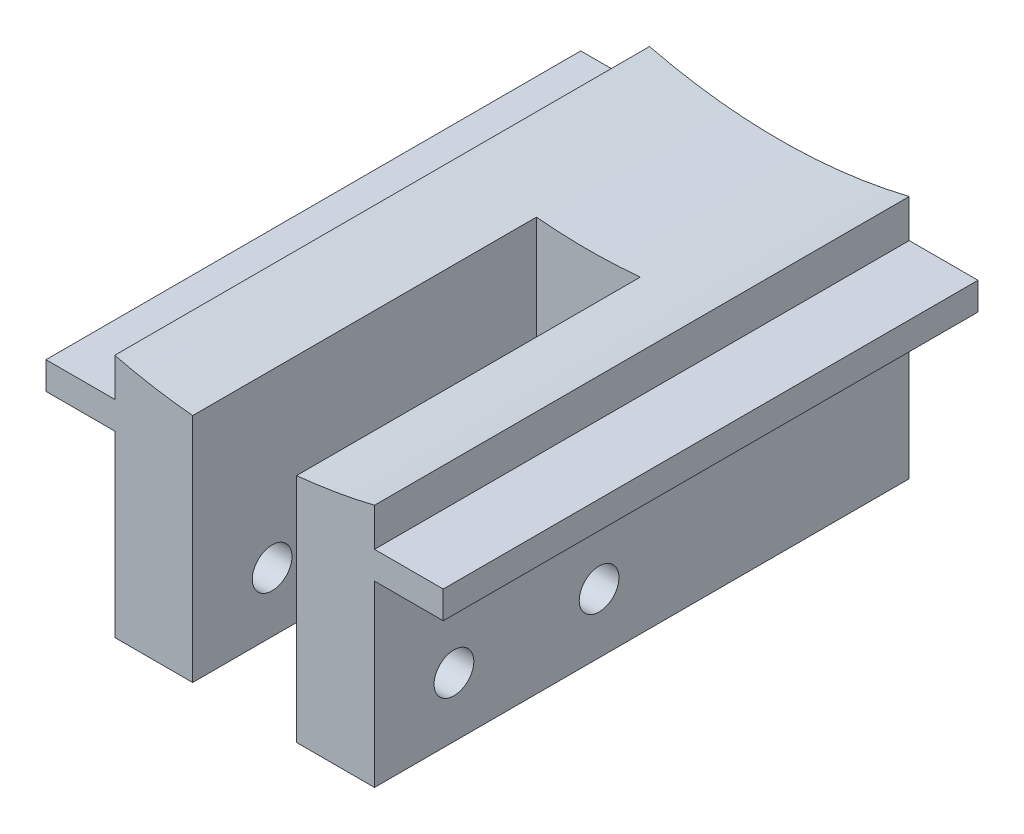
ISO-10303-21;
HEADER;
FILE_DESCRIPTION(('STEP AP214'),'2;1');
FILE_NAME('part.step','',(''),(''),'','','');
FILE_SCHEMA(('AUTOMOTIVE_DESIGN { 1 0 10303 214 1 1 1 1 }'));
ENDSEC;
DATA;
#1=APPLICATION_CONTEXT('core data for automotive mechanical design processes');
#2=APPLICATION_PROTOCOL_DEFINITION('international standard','automotive_design',2000,#1);
#3=PRODUCT_CONTEXT('',#1,'mechanical');
#4=PRODUCT('Part','Part','',(#3));
#5=PRODUCT_RELATED_PRODUCT_CATEGORY('part','',(#4));
#6=PRODUCT_DEFINITION_FORMATION('','',#4);
#7=PRODUCT_DEFINITION_CONTEXT('part definition',#1,'design');
#8=PRODUCT_DEFINITION('design','',#6,#7);
#9=PRODUCT_DEFINITION_SHAPE('','',#8);
#10=(LENGTH_UNIT() NAMED_UNIT(*) SI_UNIT(.MILLI.,.METRE.));
#11=(NAMED_UNIT(*) PLANE_ANGLE_UNIT() SI_UNIT($,.RADIAN.));
#12=(NAMED_UNIT(*) SI_UNIT($,.STERADIAN.) SOLID_ANGLE_UNIT());
#13=UNCERTAINTY_MEASURE_WITH_UNIT(LENGTH_MEASURE(1.E-05),#10,'distance_accuracy_value','');
#14=(GEOMETRIC_REPRESENTATION_CONTEXT(3) GLOBAL_UNCERTAINTY_ASSIGNED_CONTEXT((#13)) GLOBAL_UNIT_ASSIGNED_CONTEXT((#10,
#11,#12)) REPRESENTATION_CONTEXT('',''));
#15=CARTESIAN_POINT('',(0.,0.,0.));
#16=DIRECTION('',(0.,0.,1.));
#17=DIRECTION('',(1.,0.,0.));
#18=AXIS2_PLACEMENT_3D('',#15,#16,#17);
#19=CARTESIAN_POINT('',(-8.50000000000001,-8.,-35.));
#20=DIRECTION('',(-1.,0.,0.));
#21=DIRECTION('',(0.,0.,1.));
#22=AXIS2_PLACEMENT_3D('',#19,#20,#21);
#23=PLANE('',#22);
#24=DIRECTION('',(0.,-1.,0.));
#25=VECTOR('',#24,1.);
#26=CARTESIAN_POINT('',(-8.50000000000001,-8.,-35.));
#27=LINE('',#26,#25);
#28=CARTESIAN_POINT('',(-8.50000000000001,8.00000000000001,-35.));
#29=VERTEX_POINT('',#28);
#30=CARTESIAN_POINT('',(-8.50000000000001,5.5,-35.));
#31=VERTEX_POINT('',#30);
#32=EDGE_CURVE('E161',#29,#31,#27,.T.);
#33=ORIENTED_EDGE('',*,*,#32,.T.);
#34=DIRECTION('',(0.,0.,1.));
#35=VECTOR('',#34,1.);
#36=CARTESIAN_POINT('',(-8.50000000000001,5.5,-35.));
#37=LINE('',#36,#35);
#38=CARTESIAN_POINT('',(-8.50000000000001,5.5,0.));
#39=VERTEX_POINT('',#38);
#40=EDGE_CURVE('E169',#31,#39,#37,.T.);
#41=ORIENTED_EDGE('',*,*,#40,.T.);
#42=DIRECTION('',(0.,-1.,0.));
#43=VECTOR('',#42,1.);
#44=CARTESIAN_POINT('',(-8.50000000000001,-8.,0.));
#45=LINE('',#44,#43);
#46=CARTESIAN_POINT('',(-8.50000000000001,8.00000000000001,0.));
#47=VERTEX_POINT('',#46);
#48=EDGE_CURVE('E200',#47,#39,#45,.T.);
#49=ORIENTED_EDGE('',*,*,#48,.F.);
#50=DIRECTION('',(0.,0.,1.));
#51=VECTOR('',#50,1.);
#52=CARTESIAN_POINT('',(-8.50000000000001,8.00000000000001,-35.));
#53=LINE('',#52,#51);
#54=EDGE_CURVE('E11',#29,#47,#53,.T.);
#55=ORIENTED_EDGE('',*,*,#54,.F.);
#56=EDGE_LOOP('',(#33,#41,#49,#55));
#57=FACE_BOUND('',#56,.T.);
#58=ADVANCED_FACE('F39',(#57),#23,.T.);
#59=CARTESIAN_POINT('',(8.50000000000001,-8.,-35.));
#60=DIRECTION('',(1.,0.,0.));
#61=DIRECTION('',(0.,1.,0.));
#62=AXIS2_PLACEMENT_3D('',#59,#60,#61);
#63=PLANE('',#62);
#64=CARTESIAN_POINT('',(8.50000000000001,-4.1,-5.2));
#65=DIRECTION('',(-1.,0.,0.));
#66=DIRECTION('',(0.,0.,1.));
#67=AXIS2_PLACEMENT_3D('',#64,#65,#66);
#68=CIRCLE('',#67,1.3);
#69=CARTESIAN_POINT('',(8.50000000000001,-4.1,-3.9));
#70=VERTEX_POINT('',#69);
#71=EDGE_CURVE('E231',#70,#70,#68,.T.);
#72=ORIENTED_EDGE('',*,*,#71,.T.);
#73=EDGE_LOOP('',(#72));
#74=FACE_BOUND('',#73,.T.);
#75=CARTESIAN_POINT('',(8.50000000000001,-4.1,-14.7));
#76=DIRECTION('',(-1.,0.,0.));
#77=DIRECTION('',(0.,0.,1.));
#78=AXIS2_PLACEMENT_3D('',#75,#76,#77);
#79=CIRCLE('',#78,1.3);
#80=CARTESIAN_POINT('',(8.50000000000001,-4.1,-13.4));
#81=VERTEX_POINT('',#80);
#82=EDGE_CURVE('E245',#81,#81,#79,.T.);
#83=ORIENTED_EDGE('',*,*,#82,.T.);
#84=EDGE_LOOP('',(#83));
#85=FACE_BOUND('',#84,.T.);
#86=DIRECTION('',(0.,1.,0.));
#87=VECTOR('',#86,1.);
#88=CARTESIAN_POINT('',(8.50000000000001,-8.,-35.));
#89=LINE('',#88,#87);
#90=CARTESIAN_POINT('',(8.50000000000001,-8.,-35.));
#91=VERTEX_POINT('',#90);
#92=CARTESIAN_POINT('',(8.50000000000001,3.7,-35.));
#93=VERTEX_POINT('',#92);
#94=EDGE_CURVE('E192',#91,#93,#89,.T.);
#95=ORIENTED_EDGE('',*,*,#94,.T.);
#96=DIRECTION('',(0.,0.,1.));
#97=VECTOR('',#96,1.);
#98=CARTESIAN_POINT('',(8.50000000000001,3.7,-35.));
#99=LINE('',#98,#97);
#100=CARTESIAN_POINT('',(8.5,3.7,0.));
#101=VERTEX_POINT('',#100);
#102=EDGE_CURVE('E248',#93,#101,#99,.T.);
#103=ORIENTED_EDGE('',*,*,#102,.T.);
#104=DIRECTION('',(0.,1.,0.));
#105=VECTOR('',#104,1.);
#106=CARTESIAN_POINT('',(8.50000000000001,-8.,0.));
#107=LINE('',#106,#105);
#108=CARTESIAN_POINT('',(8.50000000000001,-8.,0.));
#109=VERTEX_POINT('',#108);
#110=EDGE_CURVE('E210',#109,#101,#107,.T.);
#111=ORIENTED_EDGE('',*,*,#110,.F.);
#112=DIRECTION('',(0.,0.,1.));
#113=VECTOR('',#112,1.);
#114=CARTESIAN_POINT('',(8.50000000000001,-8.,-35.));
#115=LINE('',#114,#113);
#116=EDGE_CURVE('E221',#91,#109,#115,.T.);
#117=ORIENTED_EDGE('',*,*,#116,.F.);
#118=EDGE_LOOP('',(#95,#103,#111,#117));
#119=FACE_BOUND('',#118,.T.);
#120=ADVANCED_FACE('F323',(#74,#85,#119),#63,.T.);
#121=CARTESIAN_POINT('',(0.,42.4673758792282,0.));
#122=DIRECTION('',(0.,0.,1.));
#123=DIRECTION('',(1.,0.,0.));
#124=AXIS2_PLACEMENT_3D('',#121,#122,#123);
#125=PLANE('',#124);
#126=DIRECTION('',(0.,-1.,0.));
#127=VECTOR('',#126,1.);
#128=CARTESIAN_POINT('',(-3.4,-8.,0.));
#129=LINE('',#128,#127);
#130=CARTESIAN_POINT('',(-3.4,7.13056787397675,0.));
#131=VERTEX_POINT('',#130);
#132=CARTESIAN_POINT('',(-3.4,-8.,0.));
#133=VERTEX_POINT('',#132);
#134=EDGE_CURVE('E263',#131,#133,#129,.T.);
#135=ORIENTED_EDGE('',*,*,#134,.F.);
#136=CARTESIAN_POINT('',(0.,42.4673758792282,0.));
#137=DIRECTION('',(0.,0.,-1.));
#138=DIRECTION('',(1.,0.,0.));
#139=AXIS2_PLACEMENT_3D('',#136,#137,#138);
#140=CIRCLE('',#139,35.5);
#141=EDGE_CURVE('E214',#131,#47,#140,.T.);
#142=ORIENTED_EDGE('',*,*,#141,.T.);
#143=ORIENTED_EDGE('',*,*,#48,.T.);
#144=DIRECTION('',(1.,0.,0.));
#145=VECTOR('',#144,1.);
#146=CARTESIAN_POINT('',(-8.50000000000001,5.5,0.));
#147=LINE('',#146,#145);
#148=CARTESIAN_POINT('',(-13.,5.5,0.));
#149=VERTEX_POINT('',#148);
#150=EDGE_CURVE('E57',#149,#39,#147,.T.);
#151=ORIENTED_EDGE('',*,*,#150,.F.);
#152=DIRECTION('',(0.,1.,0.));
#153=VECTOR('',#152,1.);
#154=CARTESIAN_POINT('',(-13.,5.5,0.));
#155=LINE('',#154,#153);
#156=CARTESIAN_POINT('',(-13.,3.7,0.));
#157=VERTEX_POINT('',#156);
#158=EDGE_CURVE('E384',#157,#149,#155,.T.);
#159=ORIENTED_EDGE('',*,*,#158,.F.);
#160=DIRECTION('',(-1.,0.,0.));
#161=VECTOR('',#160,1.);
#162=CARTESIAN_POINT('',(-8.50000000000001,3.7,0.));
#163=LINE('',#162,#161);
#164=CARTESIAN_POINT('',(-8.50000000000001,3.7,0.));
#165=VERTEX_POINT('',#164);
#166=EDGE_CURVE('E167',#165,#157,#163,.T.);
#167=ORIENTED_EDGE('',*,*,#166,.F.);
#168=CARTESIAN_POINT('',(-8.50000000000001,-8.,0.));
#169=VERTEX_POINT('',#168);
#170=EDGE_CURVE('E204',#165,#169,#45,.T.);
#171=ORIENTED_EDGE('',*,*,#170,.T.);
#172=DIRECTION('',(1.,0.,0.));
#173=VECTOR('',#172,1.);
#174=CARTESIAN_POINT('',(-8.50000000000001,-8.,0.));
#175=LINE('',#174,#173);
#176=EDGE_CURVE('E205',#169,#133,#175,.T.);
#177=ORIENTED_EDGE('',*,*,#176,.T.);
#178=EDGE_LOOP('',(#135,#142,#143,#151,#159,#167,#171,#177));
#179=FACE_BOUND('',#178,.T.);
#180=ADVANCED_FACE('F306',(#179),#125,.T.);
#181=DIRECTION('',(0.,0.,1.));
#182=VECTOR('',#181,1.);
#183=CARTESIAN_POINT('',(-8.50000000000001,3.7,-35.));
#184=LINE('',#183,#182);
#185=CARTESIAN_POINT('',(-8.50000000000001,3.7,-35.));
#186=VERTEX_POINT('',#185);
#187=EDGE_CURVE('E368',#186,#165,#184,.T.);
#188=ORIENTED_EDGE('',*,*,#187,.F.);
#189=CARTESIAN_POINT('',(-8.50000000000001,-8.,-35.));
#190=VERTEX_POINT('',#189);
#191=EDGE_CURVE('E180',#186,#190,#27,.T.);
#192=ORIENTED_EDGE('',*,*,#191,.T.);
#193=DIRECTION('',(0.,0.,1.));
#194=VECTOR('',#193,1.);
#195=CARTESIAN_POINT('',(-8.50000000000001,-8.,-35.));
#196=LINE('',#195,#194);
#197=EDGE_CURVE('E199',#190,#169,#196,.T.);
#198=ORIENTED_EDGE('',*,*,#197,.T.);
#199=ORIENTED_EDGE('',*,*,#170,.F.);
#200=EDGE_LOOP('',(#188,#192,#198,#199));
#201=FACE_BOUND('',#200,.T.);
#202=CARTESIAN_POINT('',(-8.50000000000001,-4.1,-5.2));
#203=DIRECTION('',(-1.,0.,0.));
#204=DIRECTION('',(0.,0.,1.));
#205=AXIS2_PLACEMENT_3D('',#202,#203,#204);
#206=CIRCLE('',#205,1.3);
#207=CARTESIAN_POINT('',(-8.50000000000001,-4.1,-3.9));
#208=VERTEX_POINT('',#207);
#209=EDGE_CURVE('E239',#208,#208,#206,.T.);
#210=ORIENTED_EDGE('',*,*,#209,.F.);
#211=EDGE_LOOP('',(#210));
#212=FACE_BOUND('',#211,.T.);
#213=CARTESIAN_POINT('',(-8.50000000000001,-4.1,-14.7));
#214=DIRECTION('',(-1.,0.,0.));
#215=DIRECTION('',(0.,0.,1.));
#216=AXIS2_PLACEMENT_3D('',#213,#214,#215);
#217=CIRCLE('',#216,1.3);
#218=CARTESIAN_POINT('',(-8.50000000000001,-4.1,-13.4));
#219=VERTEX_POINT('',#218);
#220=EDGE_CURVE('E254',#219,#219,#217,.T.);
#221=ORIENTED_EDGE('',*,*,#220,.F.);
#222=EDGE_LOOP('',(#221));
#223=FACE_BOUND('',#222,.T.);
#224=ADVANCED_FACE('F41',(#201,#212,#223),#23,.T.);
#225=CARTESIAN_POINT('',(0.,42.4673758792282,-35.));
#226=DIRECTION('',(0.,0.,1.));
#227=DIRECTION('',(1.,0.,0.));
#228=AXIS2_PLACEMENT_3D('',#225,#226,#227);
#229=CYLINDRICAL_SURFACE('',#228,35.5);
#230=DIRECTION('',(0.,0.,1.));
#231=VECTOR('',#230,1.);
#232=CARTESIAN_POINT('',(-3.4,7.13056787397675,-22.5));
#233=LINE('',#232,#231);
#234=CARTESIAN_POINT('',(-3.4,7.13056787397675,-22.5));
#235=VERTEX_POINT('',#234);
#236=EDGE_CURVE('E285',#235,#131,#233,.T.);
#237=ORIENTED_EDGE('',*,*,#236,.F.);
#238=CARTESIAN_POINT('',(0.,42.4673758792282,-22.5));
#239=DIRECTION('',(0.,0.,-1.));
#240=DIRECTION('',(1.,0.,0.));
#241=AXIS2_PLACEMENT_3D('',#238,#239,#240);
#242=CIRCLE('',#241,35.5);
#243=CARTESIAN_POINT('',(3.4,7.13056787397676,-22.5));
#244=VERTEX_POINT('',#243);
#245=EDGE_CURVE('E277',#244,#235,#242,.T.);
#246=ORIENTED_EDGE('',*,*,#245,.F.);
#247=DIRECTION('',(0.,0.,1.));
#248=VECTOR('',#247,1.);
#249=CARTESIAN_POINT('',(3.4,7.13056787397676,-22.5));
#250=LINE('',#249,#248);
#251=CARTESIAN_POINT('',(3.4,7.13056787397676,0.));
#252=VERTEX_POINT('',#251);
#253=EDGE_CURVE('E288',#244,#252,#250,.T.);
#254=ORIENTED_EDGE('',*,*,#253,.T.);
#255=CARTESIAN_POINT('',(8.49999999999999,8.,0.));
#256=VERTEX_POINT('',#255);
#257=EDGE_CURVE('E187',#256,#252,#140,.T.);
#258=ORIENTED_EDGE('',*,*,#257,.F.);
#259=DIRECTION('',(0.,0.,1.));
#260=VECTOR('',#259,1.);
#261=CARTESIAN_POINT('',(8.49999999999999,8.,-35.));
#262=LINE('',#261,#260);
#263=CARTESIAN_POINT('',(8.49999999999999,8.,-35.));
#264=VERTEX_POINT('',#263);
#265=EDGE_CURVE('E49',#264,#256,#262,.T.);
#266=ORIENTED_EDGE('',*,*,#265,.F.);
#267=CARTESIAN_POINT('',(0.,42.4673758792282,-35.));
#268=DIRECTION('',(0.,0.,-1.));
#269=DIRECTION('',(1.,0.,0.));
#270=AXIS2_PLACEMENT_3D('',#267,#268,#269);
#271=CIRCLE('',#270,35.5);
#272=EDGE_CURVE('E196',#264,#29,#271,.T.);
#273=ORIENTED_EDGE('',*,*,#272,.T.);
#274=ORIENTED_EDGE('',*,*,#54,.T.);
#275=ORIENTED_EDGE('',*,*,#141,.F.);
#276=EDGE_LOOP('',(#237,#246,#254,#258,#266,#273,#274,#275));
#277=FACE_BOUND('',#276,.T.);
#278=ADVANCED_FACE('F332',(#277),#229,.F.);
#279=DIRECTION('',(0.,0.,1.));
#280=VECTOR('',#279,1.);
#281=CARTESIAN_POINT('',(8.50000000000001,5.5,-35.));
#282=LINE('',#281,#280);
#283=CARTESIAN_POINT('',(8.50000000000001,5.5,-35.));
#284=VERTEX_POINT('',#283);
#285=CARTESIAN_POINT('',(8.50000000000001,5.5,0.));
#286=VERTEX_POINT('',#285);
#287=EDGE_CURVE('E257',#284,#286,#282,.T.);
#288=ORIENTED_EDGE('',*,*,#287,.F.);
#289=EDGE_CURVE('E185',#284,#264,#89,.T.);
#290=ORIENTED_EDGE('',*,*,#289,.T.);
#291=ORIENTED_EDGE('',*,*,#265,.T.);
#292=EDGE_CURVE('E209',#286,#256,#107,.T.);
#293=ORIENTED_EDGE('',*,*,#292,.F.);
#294=EDGE_LOOP('',(#288,#290,#291,#293));
#295=FACE_BOUND('',#294,.T.);
#296=ADVANCED_FACE('F341',(#295),#63,.T.);
#297=CARTESIAN_POINT('',(-8.50000000000001,-8.,-35.));
#298=DIRECTION('',(0.,-1.,0.));
#299=DIRECTION('',(0.,0.,-1.));
#300=AXIS2_PLACEMENT_3D('',#297,#298,#299);
#301=PLANE('',#300);
#302=DIRECTION('',(0.,0.,1.));
#303=VECTOR('',#302,1.);
#304=CARTESIAN_POINT('',(-3.4,-8.,-22.5));
#305=LINE('',#304,#303);
#306=CARTESIAN_POINT('',(-3.4,-8.,-22.5));
#307=VERTEX_POINT('',#306);
#308=EDGE_CURVE('E189',#307,#133,#305,.T.);
#309=ORIENTED_EDGE('',*,*,#308,.T.);
#310=ORIENTED_EDGE('',*,*,#176,.F.);
#311=ORIENTED_EDGE('',*,*,#197,.F.);
#312=DIRECTION('',(1.,0.,0.));
#313=VECTOR('',#312,1.);
#314=CARTESIAN_POINT('',(-8.50000000000001,-8.,-35.));
#315=LINE('',#314,#313);
#316=EDGE_CURVE('E179',#190,#91,#315,.T.);
#317=ORIENTED_EDGE('',*,*,#316,.T.);
#318=ORIENTED_EDGE('',*,*,#116,.T.);
#319=CARTESIAN_POINT('',(3.4,-8.,0.));
#320=VERTEX_POINT('',#319);
#321=EDGE_CURVE('E203',#320,#109,#175,.T.);
#322=ORIENTED_EDGE('',*,*,#321,.F.);
#323=DIRECTION('',(0.,0.,1.));
#324=VECTOR('',#323,1.);
#325=CARTESIAN_POINT('',(3.4,-8.,-22.5));
#326=LINE('',#325,#324);
#327=CARTESIAN_POINT('',(3.4,-8.,-22.5));
#328=VERTEX_POINT('',#327);
#329=EDGE_CURVE('E291',#328,#320,#326,.T.);
#330=ORIENTED_EDGE('',*,*,#329,.F.);
#331=DIRECTION('',(1.,0.,0.));
#332=VECTOR('',#331,1.);
#333=CARTESIAN_POINT('',(-3.4,-8.,-22.5));
#334=LINE('',#333,#332);
#335=EDGE_CURVE('E268',#307,#328,#334,.T.);
#336=ORIENTED_EDGE('',*,*,#335,.F.);
#337=EDGE_LOOP('',(#309,#310,#311,#317,#318,#322,#330,#336));
#338=FACE_BOUND('',#337,.T.);
#339=ADVANCED_FACE('F301',(#338),#301,.T.);
#340=CARTESIAN_POINT('',(0.,42.4673758792282,-35.));
#341=DIRECTION('',(0.,0.,1.));
#342=DIRECTION('',(1.,0.,0.));
#343=AXIS2_PLACEMENT_3D('',#340,#341,#342);
#344=PLANE('',#343);
#345=ORIENTED_EDGE('',*,*,#32,.F.);
#346=ORIENTED_EDGE('',*,*,#272,.F.);
#347=ORIENTED_EDGE('',*,*,#289,.F.);
#348=DIRECTION('',(-1.,0.,0.));
#349=VECTOR('',#348,1.);
#350=CARTESIAN_POINT('',(8.50000000000001,5.5,-35.));
#351=LINE('',#350,#349);
#352=CARTESIAN_POINT('',(13.,5.5,-35.));
#353=VERTEX_POINT('',#352);
#354=EDGE_CURVE('E337',#353,#284,#351,.T.);
#355=ORIENTED_EDGE('',*,*,#354,.F.);
#356=DIRECTION('',(0.,1.,0.));
#357=VECTOR('',#356,1.);
#358=CARTESIAN_POINT('',(13.,5.5,-35.));
#359=LINE('',#358,#357);
#360=CARTESIAN_POINT('',(13.,3.7,-35.));
#361=VERTEX_POINT('',#360);
#362=EDGE_CURVE('E359',#361,#353,#359,.T.);
#363=ORIENTED_EDGE('',*,*,#362,.F.);
#364=DIRECTION('',(1.,0.,0.));
#365=VECTOR('',#364,1.);
#366=CARTESIAN_POINT('',(8.50000000000001,3.7,-35.));
#367=LINE('',#366,#365);
#368=EDGE_CURVE('E321',#93,#361,#367,.T.);
#369=ORIENTED_EDGE('',*,*,#368,.F.);
#370=ORIENTED_EDGE('',*,*,#94,.F.);
#371=ORIENTED_EDGE('',*,*,#316,.F.);
#372=ORIENTED_EDGE('',*,*,#191,.F.);
#373=DIRECTION('',(-1.,0.,0.));
#374=VECTOR('',#373,1.);
#375=CARTESIAN_POINT('',(-8.50000000000001,3.7,-35.));
#376=LINE('',#375,#374);
#377=CARTESIAN_POINT('',(-13.,3.7,-35.));
#378=VERTEX_POINT('',#377);
#379=EDGE_CURVE('E176',#186,#378,#376,.T.);
#380=ORIENTED_EDGE('',*,*,#379,.T.);
#381=DIRECTION('',(0.,1.,0.));
#382=VECTOR('',#381,1.);
#383=CARTESIAN_POINT('',(-13.,5.5,-35.));
#384=LINE('',#383,#382);
#385=CARTESIAN_POINT('',(-13.,5.5,-35.));
#386=VERTEX_POINT('',#385);
#387=EDGE_CURVE('E164',#378,#386,#384,.T.);
#388=ORIENTED_EDGE('',*,*,#387,.T.);
#389=DIRECTION('',(1.,0.,0.));
#390=VECTOR('',#389,1.);
#391=CARTESIAN_POINT('',(-8.50000000000001,5.5,-35.));
#392=LINE('',#391,#390);
#393=EDGE_CURVE('E157',#386,#31,#392,.T.);
#394=ORIENTED_EDGE('',*,*,#393,.T.);
#395=EDGE_LOOP('',(#345,#346,#347,#355,#363,#369,#370,#371,#372,#380,#388,#394));
#396=FACE_BOUND('',#395,.T.);
#397=ADVANCED_FACE('F158',(#396),#344,.F.);
#398=DIRECTION('',(0.,1.,0.));
#399=VECTOR('',#398,1.);
#400=CARTESIAN_POINT('',(3.4,-8.,0.));
#401=LINE('',#400,#399);
#402=EDGE_CURVE('E269',#320,#252,#401,.T.);
#403=ORIENTED_EDGE('',*,*,#402,.F.);
#404=ORIENTED_EDGE('',*,*,#321,.T.);
#405=ORIENTED_EDGE('',*,*,#110,.T.);
#406=DIRECTION('',(1.,0.,0.));
#407=VECTOR('',#406,1.);
#408=CARTESIAN_POINT('',(8.50000000000001,3.7,0.));
#409=LINE('',#408,#407);
#410=CARTESIAN_POINT('',(13.,3.7,0.));
#411=VERTEX_POINT('',#410);
#412=EDGE_CURVE('E65',#101,#411,#409,.T.);
#413=ORIENTED_EDGE('',*,*,#412,.T.);
#414=DIRECTION('',(0.,1.,0.));
#415=VECTOR('',#414,1.);
#416=CARTESIAN_POINT('',(13.,5.5,0.));
#417=LINE('',#416,#415);
#418=CARTESIAN_POINT('',(13.,5.5,0.));
#419=VERTEX_POINT('',#418);
#420=EDGE_CURVE('E367',#411,#419,#417,.T.);
#421=ORIENTED_EDGE('',*,*,#420,.T.);
#422=DIRECTION('',(-1.,0.,0.));
#423=VECTOR('',#422,1.);
#424=CARTESIAN_POINT('',(8.50000000000001,5.5,0.));
#425=LINE('',#424,#423);
#426=EDGE_CURVE('E353',#419,#286,#425,.T.);
#427=ORIENTED_EDGE('',*,*,#426,.T.);
#428=ORIENTED_EDGE('',*,*,#292,.T.);
#429=ORIENTED_EDGE('',*,*,#257,.T.);
#430=EDGE_LOOP('',(#403,#404,#405,#413,#421,#427,#428,#429));
#431=FACE_BOUND('',#430,.T.);
#432=ADVANCED_FACE('F418',(#431),#125,.T.);
#433=CARTESIAN_POINT('',(-3.4,-8.,-22.5));
#434=DIRECTION('',(-1.,0.,0.));
#435=DIRECTION('',(0.,0.,1.));
#436=AXIS2_PLACEMENT_3D('',#433,#434,#435);
#437=PLANE('',#436);
#438=CARTESIAN_POINT('',(-3.4,-4.1,-5.2));
#439=DIRECTION('',(-1.,0.,0.));
#440=DIRECTION('',(0.,0.,1.));
#441=AXIS2_PLACEMENT_3D('',#438,#439,#440);
#442=CIRCLE('',#441,1.3);
#443=CARTESIAN_POINT('',(-3.4,-4.1,-3.9));
#444=VERTEX_POINT('',#443);
#445=EDGE_CURVE('E259',#444,#444,#442,.T.);
#446=ORIENTED_EDGE('',*,*,#445,.T.);
#447=EDGE_LOOP('',(#446));
#448=FACE_BOUND('',#447,.T.);
#449=CARTESIAN_POINT('',(-3.4,-4.1,-14.7));
#450=DIRECTION('',(-1.,0.,0.));
#451=DIRECTION('',(0.,0.,1.));
#452=AXIS2_PLACEMENT_3D('',#449,#450,#451);
#453=CIRCLE('',#452,1.3);
#454=CARTESIAN_POINT('',(-3.4,-4.1,-13.4));
#455=VERTEX_POINT('',#454);
#456=EDGE_CURVE('E230',#455,#455,#453,.T.);
#457=ORIENTED_EDGE('',*,*,#456,.T.);
#458=EDGE_LOOP('',(#457));
#459=FACE_BOUND('',#458,.T.);
#460=ORIENTED_EDGE('',*,*,#134,.T.);
#461=ORIENTED_EDGE('',*,*,#308,.F.);
#462=DIRECTION('',(0.,-1.,0.));
#463=VECTOR('',#462,1.);
#464=CARTESIAN_POINT('',(-3.4,-8.,-22.5));
#465=LINE('',#464,#463);
#466=EDGE_CURVE('E264',#235,#307,#465,.T.);
#467=ORIENTED_EDGE('',*,*,#466,.F.);
#468=ORIENTED_EDGE('',*,*,#236,.T.);
#469=EDGE_LOOP('',(#460,#461,#467,#468));
#470=FACE_BOUND('',#469,.T.);
#471=ADVANCED_FACE('F423',(#448,#459,#470),#437,.F.);
#472=CARTESIAN_POINT('',(3.4,-8.,-22.5));
#473=DIRECTION('',(1.,0.,0.));
#474=DIRECTION('',(0.,0.,-1.));
#475=AXIS2_PLACEMENT_3D('',#472,#473,#474);
#476=PLANE('',#475);
#477=CARTESIAN_POINT('',(3.4,-4.1,-5.2));
#478=DIRECTION('',(1.,0.,0.));
#479=DIRECTION('',(0.,0.,-1.));
#480=AXIS2_PLACEMENT_3D('',#477,#478,#479);
#481=CIRCLE('',#480,1.3);
#482=CARTESIAN_POINT('',(3.4,-4.1,-6.5));
#483=VERTEX_POINT('',#482);
#484=EDGE_CURVE('E43',#483,#483,#481,.T.);
#485=ORIENTED_EDGE('',*,*,#484,.T.);
#486=EDGE_LOOP('',(#485));
#487=FACE_BOUND('',#486,.T.);
#488=CARTESIAN_POINT('',(3.4,-4.1,-14.7));
#489=DIRECTION('',(1.,0.,0.));
#490=DIRECTION('',(0.,0.,-1.));
#491=AXIS2_PLACEMENT_3D('',#488,#489,#490);
#492=CIRCLE('',#491,1.3);
#493=CARTESIAN_POINT('',(3.4,-4.1,-16.));
#494=VERTEX_POINT('',#493);
#495=EDGE_CURVE('E227',#494,#494,#492,.T.);
#496=ORIENTED_EDGE('',*,*,#495,.T.);
#497=EDGE_LOOP('',(#496));
#498=FACE_BOUND('',#497,.T.);
#499=ORIENTED_EDGE('',*,*,#402,.T.);
#500=ORIENTED_EDGE('',*,*,#253,.F.);
#501=DIRECTION('',(0.,1.,0.));
#502=VECTOR('',#501,1.);
#503=CARTESIAN_POINT('',(3.4,-8.,-22.5));
#504=LINE('',#503,#502);
#505=EDGE_CURVE('E273',#328,#244,#504,.T.);
#506=ORIENTED_EDGE('',*,*,#505,.F.);
#507=ORIENTED_EDGE('',*,*,#329,.T.);
#508=EDGE_LOOP('',(#499,#500,#506,#507));
#509=FACE_BOUND('',#508,.T.);
#510=ADVANCED_FACE('F428',(#487,#498,#509),#476,.F.);
#511=CARTESIAN_POINT('',(0.,42.4673758792282,-22.5));
#512=DIRECTION('',(0.,0.,1.));
#513=DIRECTION('',(1.,0.,0.));
#514=AXIS2_PLACEMENT_3D('',#511,#512,#513);
#515=PLANE('',#514);
#516=ORIENTED_EDGE('',*,*,#466,.T.);
#517=ORIENTED_EDGE('',*,*,#335,.T.);
#518=ORIENTED_EDGE('',*,*,#505,.T.);
#519=ORIENTED_EDGE('',*,*,#245,.T.);
#520=EDGE_LOOP('',(#516,#517,#518,#519));
#521=FACE_BOUND('',#520,.T.);
#522=ADVANCED_FACE('F433',(#521),#515,.T.);
#523=CARTESIAN_POINT('',(8.50000000000001,-4.1,-14.7));
#524=DIRECTION('',(-1.,0.,0.));
#525=DIRECTION('',(0.,0.,1.));
#526=AXIS2_PLACEMENT_3D('',#523,#524,#525);
#527=CYLINDRICAL_SURFACE('',#526,1.3);
#528=ORIENTED_EDGE('',*,*,#82,.F.);
#529=EDGE_LOOP('',(#528));
#530=FACE_BOUND('',#529,.T.);
#531=ORIENTED_EDGE('',*,*,#495,.F.);
#532=EDGE_LOOP('',(#531));
#533=FACE_BOUND('',#532,.T.);
#534=ADVANCED_FACE('F435',(#530,#533),#527,.F.);
#535=CARTESIAN_POINT('',(8.50000000000001,-4.1,-5.2));
#536=DIRECTION('',(-1.,0.,0.));
#537=DIRECTION('',(0.,0.,1.));
#538=AXIS2_PLACEMENT_3D('',#535,#536,#537);
#539=CYLINDRICAL_SURFACE('',#538,1.3);
#540=ORIENTED_EDGE('',*,*,#71,.F.);
#541=EDGE_LOOP('',(#540));
#542=FACE_BOUND('',#541,.T.);
#543=ORIENTED_EDGE('',*,*,#484,.F.);
#544=EDGE_LOOP('',(#543));
#545=FACE_BOUND('',#544,.T.);
#546=ADVANCED_FACE('F441',(#542,#545),#539,.F.);
#547=ORIENTED_EDGE('',*,*,#220,.T.);
#548=EDGE_LOOP('',(#547));
#549=FACE_BOUND('',#548,.T.);
#550=ORIENTED_EDGE('',*,*,#456,.F.);
#551=EDGE_LOOP('',(#550));
#552=FACE_BOUND('',#551,.T.);
#553=ADVANCED_FACE('F444',(#549,#552),#527,.F.);
#554=ORIENTED_EDGE('',*,*,#209,.T.);
#555=EDGE_LOOP('',(#554));
#556=FACE_BOUND('',#555,.T.);
#557=ORIENTED_EDGE('',*,*,#445,.F.);
#558=EDGE_LOOP('',(#557));
#559=FACE_BOUND('',#558,.T.);
#560=ADVANCED_FACE('F449',(#556,#559),#539,.F.);
#561=CARTESIAN_POINT('',(8.50000000000001,5.5,-35.));
#562=DIRECTION('',(0.,1.,0.));
#563=DIRECTION('',(0.,0.,1.));
#564=AXIS2_PLACEMENT_3D('',#561,#562,#563);
#565=PLANE('',#564);
#566=ORIENTED_EDGE('',*,*,#426,.F.);
#567=DIRECTION('',(0.,0.,1.));
#568=VECTOR('',#567,1.);
#569=CARTESIAN_POINT('',(13.,5.5,-35.));
#570=LINE('',#569,#568);
#571=EDGE_CURVE('E347',#353,#419,#570,.T.);
#572=ORIENTED_EDGE('',*,*,#571,.F.);
#573=ORIENTED_EDGE('',*,*,#354,.T.);
#574=ORIENTED_EDGE('',*,*,#287,.T.);
#575=EDGE_LOOP('',(#566,#572,#573,#574));
#576=FACE_BOUND('',#575,.T.);
#577=ADVANCED_FACE('F453',(#576),#565,.T.);
#578=CARTESIAN_POINT('',(13.,5.5,-35.));
#579=DIRECTION('',(1.,0.,0.));
#580=DIRECTION('',(0.,0.,-1.));
#581=AXIS2_PLACEMENT_3D('',#578,#579,#580);
#582=PLANE('',#581);
#583=ORIENTED_EDGE('',*,*,#420,.F.);
#584=DIRECTION('',(0.,0.,1.));
#585=VECTOR('',#584,1.);
#586=CARTESIAN_POINT('',(13.,3.7,-35.));
#587=LINE('',#586,#585);
#588=EDGE_CURVE('E350',#361,#411,#587,.T.);
#589=ORIENTED_EDGE('',*,*,#588,.F.);
#590=ORIENTED_EDGE('',*,*,#362,.T.);
#591=ORIENTED_EDGE('',*,*,#571,.T.);
#592=EDGE_LOOP('',(#583,#589,#590,#591));
#593=FACE_BOUND('',#592,.T.);
#594=ADVANCED_FACE('F457',(#593),#582,.T.);
#595=CARTESIAN_POINT('',(8.50000000000001,3.7,-35.));
#596=DIRECTION('',(0.,-1.,0.));
#597=DIRECTION('',(0.,0.,-1.));
#598=AXIS2_PLACEMENT_3D('',#595,#596,#597);
#599=PLANE('',#598);
#600=ORIENTED_EDGE('',*,*,#412,.F.);
#601=ORIENTED_EDGE('',*,*,#102,.F.);
#602=ORIENTED_EDGE('',*,*,#368,.T.);
#603=ORIENTED_EDGE('',*,*,#588,.T.);
#604=EDGE_LOOP('',(#600,#601,#602,#603));
#605=FACE_BOUND('',#604,.T.);
#606=ADVANCED_FACE('F404',(#605),#599,.T.);
#607=CARTESIAN_POINT('',(-8.50000000000001,3.7,-35.));
#608=DIRECTION('',(0.,1.,0.));
#609=DIRECTION('',(0.,0.,1.));
#610=AXIS2_PLACEMENT_3D('',#607,#608,#609);
#611=PLANE('',#610);
#612=ORIENTED_EDGE('',*,*,#166,.T.);
#613=DIRECTION('',(0.,0.,1.));
#614=VECTOR('',#613,1.);
#615=CARTESIAN_POINT('',(-13.,3.7,-35.));
#616=LINE('',#615,#614);
#617=EDGE_CURVE('E376',#378,#157,#616,.T.);
#618=ORIENTED_EDGE('',*,*,#617,.F.);
#619=ORIENTED_EDGE('',*,*,#379,.F.);
#620=ORIENTED_EDGE('',*,*,#187,.T.);
#621=EDGE_LOOP('',(#612,#618,#619,#620));
#622=FACE_BOUND('',#621,.T.);
#623=ADVANCED_FACE('F394',(#622),#611,.F.);
#624=CARTESIAN_POINT('',(-13.,5.5,-35.));
#625=DIRECTION('',(1.,0.,0.));
#626=DIRECTION('',(0.,0.,-1.));
#627=AXIS2_PLACEMENT_3D('',#624,#625,#626);
#628=PLANE('',#627);
#629=ORIENTED_EDGE('',*,*,#158,.T.);
#630=DIRECTION('',(0.,0.,1.));
#631=VECTOR('',#630,1.);
#632=CARTESIAN_POINT('',(-13.,5.5,-35.));
#633=LINE('',#632,#631);
#634=EDGE_CURVE('E175',#386,#149,#633,.T.);
#635=ORIENTED_EDGE('',*,*,#634,.F.);
#636=ORIENTED_EDGE('',*,*,#387,.F.);
#637=ORIENTED_EDGE('',*,*,#617,.T.);
#638=EDGE_LOOP('',(#629,#635,#636,#637));
#639=FACE_BOUND('',#638,.T.);
#640=ADVANCED_FACE('F396',(#639),#628,.F.);
#641=CARTESIAN_POINT('',(-8.50000000000001,5.5,-35.));
#642=DIRECTION('',(0.,-1.,0.));
#643=DIRECTION('',(0.,0.,-1.));
#644=AXIS2_PLACEMENT_3D('',#641,#642,#643);
#645=PLANE('',#644);
#646=ORIENTED_EDGE('',*,*,#150,.T.);
#647=ORIENTED_EDGE('',*,*,#40,.F.);
#648=ORIENTED_EDGE('',*,*,#393,.F.);
#649=ORIENTED_EDGE('',*,*,#634,.T.);
#650=EDGE_LOOP('',(#646,#647,#648,#649));
#651=FACE_BOUND('',#650,.T.);
#652=ADVANCED_FACE('F170',(#651),#645,.F.);
#653=CLOSED_SHELL('',(#58,#120,#180,#224,#278,#296,#339,#397,#432,#471,#510,#522,#534,#546,#553,
#560,#577,#594,#606,#623,#640,#652));
#654=MANIFOLD_SOLID_BREP('B2',#653);
#655=ADVANCED_BREP_SHAPE_REPRESENTATION('',(#18,#654),#14);
#656=SHAPE_DEFINITION_REPRESENTATION(#9,#655);
ENDSEC;
END-ISO-10303-21;
